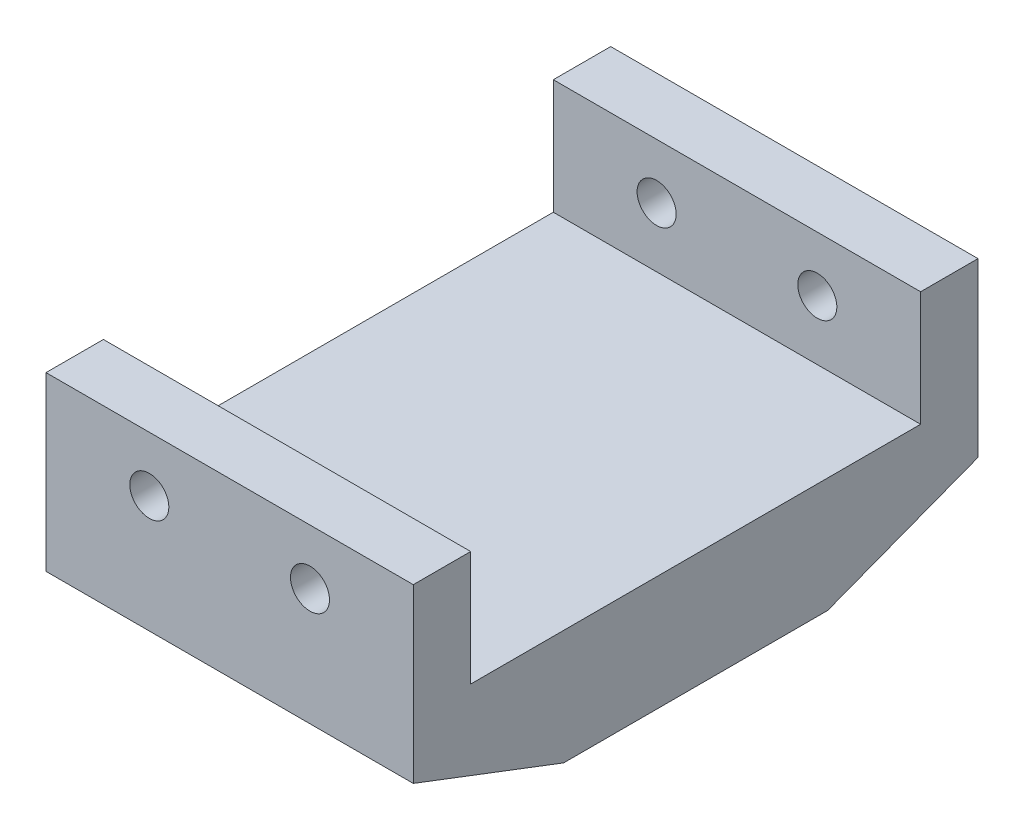
ISO-10303-21;
HEADER;
FILE_DESCRIPTION(('STEP AP214'),'2;1');
FILE_NAME('part.step','',(''),(''),'','','');
FILE_SCHEMA(('AUTOMOTIVE_DESIGN { 1 0 10303 214 1 1 1 1 }'));
ENDSEC;
DATA;
#1=APPLICATION_CONTEXT('core data for automotive mechanical design processes');
#2=APPLICATION_PROTOCOL_DEFINITION('international standard','automotive_design',2000,#1);
#3=PRODUCT_CONTEXT('',#1,'mechanical');
#4=PRODUCT('Part','Part','',(#3));
#5=PRODUCT_RELATED_PRODUCT_CATEGORY('part','',(#4));
#6=PRODUCT_DEFINITION_FORMATION('','',#4);
#7=PRODUCT_DEFINITION_CONTEXT('part definition',#1,'design');
#8=PRODUCT_DEFINITION('design','',#6,#7);
#9=PRODUCT_DEFINITION_SHAPE('','',#8);
#10=(LENGTH_UNIT() NAMED_UNIT(*) SI_UNIT(.MILLI.,.METRE.));
#11=(NAMED_UNIT(*) PLANE_ANGLE_UNIT() SI_UNIT($,.RADIAN.));
#12=(NAMED_UNIT(*) SI_UNIT($,.STERADIAN.) SOLID_ANGLE_UNIT());
#13=UNCERTAINTY_MEASURE_WITH_UNIT(LENGTH_MEASURE(1.E-05),#10,'distance_accuracy_value','');
#14=(GEOMETRIC_REPRESENTATION_CONTEXT(3) GLOBAL_UNCERTAINTY_ASSIGNED_CONTEXT((#13)) GLOBAL_UNIT_ASSIGNED_CONTEXT((#10,
#11,#12)) REPRESENTATION_CONTEXT('',''));
#15=CARTESIAN_POINT('',(0.,0.,0.));
#16=DIRECTION('',(0.,0.,1.));
#17=DIRECTION('',(1.,0.,0.));
#18=AXIS2_PLACEMENT_3D('',#15,#16,#17);
#19=CARTESIAN_POINT('',(7.,52.3000000000002,-24.5999999999998));
#20=DIRECTION('',(0.,0.,1.));
#21=DIRECTION('',(-1.,0.,0.));
#22=AXIS2_PLACEMENT_3D('',#19,#20,#21);
#23=CYLINDRICAL_SURFACE('',#22,1.7);
#24=CARTESIAN_POINT('',(7.,52.3000000000001,-19.5999999999998));
#25=DIRECTION('',(0.,0.,1.));
#26=DIRECTION('',(-1.,0.,0.));
#27=AXIS2_PLACEMENT_3D('',#24,#25,#26);
#28=CIRCLE('',#27,1.7);
#29=CARTESIAN_POINT('',(5.3,52.3000000000001,-19.5999999999998));
#30=VERTEX_POINT('',#29);
#31=EDGE_CURVE('E203',#30,#30,#28,.T.);
#32=CARTESIAN_POINT('',(7.,52.3000000000002,-24.5999999999998));
#33=DIRECTION('',(0.,0.,1.));
#34=DIRECTION('',(1.,0.,0.));
#35=AXIS2_PLACEMENT_3D('',#32,#33,#34);
#36=CIRCLE('',#35,1.7);
#37=CARTESIAN_POINT('',(5.3,52.3000000000002,-24.5999999999998));
#38=VERTEX_POINT('',#37);
#39=EDGE_CURVE('E210',#38,#38,#36,.T.);
#40=CARTESIAN_POINT('',(5.3,52.3000000000001,-19.5999999999998));
#41=CARTESIAN_POINT('',(5.3,52.3000000000001,-19.6520833333331));
#42=CARTESIAN_POINT('',(5.3,52.3000000000001,-19.7041666666664));
#43=CARTESIAN_POINT('',(5.3,52.3000000000001,-19.8083333333331));
#44=CARTESIAN_POINT('',(5.3,52.3000000000001,-19.8604166666664));
#45=CARTESIAN_POINT('',(5.3,52.3000000000001,-19.9645833333331));
#46=CARTESIAN_POINT('',(5.3,52.3000000000001,-20.0166666666664));
#47=CARTESIAN_POINT('',(5.3,52.3000000000001,-20.1208333333331));
#48=CARTESIAN_POINT('',(5.3,52.3000000000001,-20.1729166666664));
#49=CARTESIAN_POINT('',(5.3,52.3000000000001,-20.2770833333331));
#50=CARTESIAN_POINT('',(5.3,52.3000000000001,-20.3291666666664));
#51=CARTESIAN_POINT('',(5.3,52.3000000000001,-20.4333333333331));
#52=CARTESIAN_POINT('',(5.3,52.3000000000001,-20.4854166666664));
#53=CARTESIAN_POINT('',(5.3,52.3000000000001,-20.5895833333331));
#54=CARTESIAN_POINT('',(5.3,52.3000000000001,-20.6416666666664));
#55=CARTESIAN_POINT('',(5.3,52.3000000000001,-20.7458333333331));
#56=CARTESIAN_POINT('',(5.3,52.3000000000001,-20.7979166666664));
#57=CARTESIAN_POINT('',(5.3,52.3000000000001,-20.9020833333331));
#58=CARTESIAN_POINT('',(5.3,52.3000000000001,-20.9541666666664));
#59=CARTESIAN_POINT('',(5.3,52.3000000000001,-21.0583333333331));
#60=CARTESIAN_POINT('',(5.3,52.3000000000001,-21.1104166666664));
#61=CARTESIAN_POINT('',(5.3,52.3000000000001,-21.2145833333331));
#62=CARTESIAN_POINT('',(5.3,52.3000000000001,-21.2666666666664));
#63=CARTESIAN_POINT('',(5.3,52.3000000000001,-21.3708333333331));
#64=CARTESIAN_POINT('',(5.3,52.3000000000001,-21.4229166666664));
#65=CARTESIAN_POINT('',(5.3,52.3000000000001,-21.5270833333331));
#66=CARTESIAN_POINT('',(5.3,52.3000000000001,-21.5791666666664));
#67=CARTESIAN_POINT('',(5.3,52.3000000000001,-21.6833333333331));
#68=CARTESIAN_POINT('',(5.3,52.3000000000001,-21.7354166666664));
#69=CARTESIAN_POINT('',(5.3,52.3000000000001,-21.8395833333331));
#70=CARTESIAN_POINT('',(5.3,52.3000000000001,-21.8916666666664));
#71=CARTESIAN_POINT('',(5.3,52.3000000000001,-21.9958333333331));
#72=CARTESIAN_POINT('',(5.3,52.3000000000001,-22.0479166666664));
#73=CARTESIAN_POINT('',(5.3,52.3000000000001,-22.1520833333331));
#74=CARTESIAN_POINT('',(5.3,52.3000000000002,-22.2041666666664));
#75=CARTESIAN_POINT('',(5.3,52.3000000000002,-22.3083333333331));
#76=CARTESIAN_POINT('',(5.3,52.3000000000002,-22.3604166666664));
#77=CARTESIAN_POINT('',(5.3,52.3000000000002,-22.4645833333331));
#78=CARTESIAN_POINT('',(5.3,52.3000000000002,-22.5166666666664));
#79=CARTESIAN_POINT('',(5.3,52.3000000000002,-22.6208333333331));
#80=CARTESIAN_POINT('',(5.3,52.3000000000002,-22.6729166666664));
#81=CARTESIAN_POINT('',(5.3,52.3000000000002,-22.7770833333331));
#82=CARTESIAN_POINT('',(5.3,52.3000000000002,-22.8291666666664));
#83=CARTESIAN_POINT('',(5.3,52.3000000000002,-22.9333333333331));
#84=CARTESIAN_POINT('',(5.3,52.3000000000002,-22.9854166666664));
#85=CARTESIAN_POINT('',(5.3,52.3000000000002,-23.0895833333331));
#86=CARTESIAN_POINT('',(5.3,52.3000000000002,-23.1416666666664));
#87=CARTESIAN_POINT('',(5.3,52.3000000000002,-23.2458333333331));
#88=CARTESIAN_POINT('',(5.3,52.3000000000002,-23.2979166666664));
#89=CARTESIAN_POINT('',(5.3,52.3000000000002,-23.4020833333331));
#90=CARTESIAN_POINT('',(5.3,52.3000000000002,-23.4541666666664));
#91=CARTESIAN_POINT('',(5.3,52.3000000000002,-23.5583333333331));
#92=CARTESIAN_POINT('',(5.3,52.3000000000002,-23.6104166666664));
#93=CARTESIAN_POINT('',(5.3,52.3000000000002,-23.7145833333331));
#94=CARTESIAN_POINT('',(5.3,52.3000000000002,-23.7666666666664));
#95=CARTESIAN_POINT('',(5.3,52.3000000000002,-23.8708333333331));
#96=CARTESIAN_POINT('',(5.3,52.3000000000002,-23.9229166666664));
#97=CARTESIAN_POINT('',(5.3,52.3000000000002,-24.0270833333331));
#98=CARTESIAN_POINT('',(5.3,52.3000000000002,-24.0791666666664));
#99=CARTESIAN_POINT('',(5.3,52.3000000000002,-24.1833333333331));
#100=CARTESIAN_POINT('',(5.3,52.3000000000002,-24.2354166666664));
#101=CARTESIAN_POINT('',(5.3,52.3000000000002,-24.3395833333331));
#102=CARTESIAN_POINT('',(5.3,52.3000000000002,-24.3916666666664));
#103=CARTESIAN_POINT('',(5.3,52.3000000000002,-24.4958333333331));
#104=CARTESIAN_POINT('',(5.3,52.3000000000002,-24.5479166666664));
#105=CARTESIAN_POINT('',(5.3,52.3000000000002,-24.5999999999998));
#106=B_SPLINE_CURVE_WITH_KNOTS('',3,(#40,#41,#42,#43,#44,#45,#46,#47,#48,#49,#50,#51,#52,#53,
#54,#55,#56,#57,#58,#59,#60,#61,#62,#63,#64,#65,#66,#67,#68,#69,#70,#71,#72,#73,#74,#75,#76,#77,
#78,#79,#80,#81,#82,#83,#84,#85,#86,#87,#88,#89,#90,#91,#92,#93,#94,#95,#96,#97,#98,#99,#100,
#101,#102,#103,#104,#105),.UNSPECIFIED.,.F.,.F.,(4,2,2,2,2,2,2,2,2,2,2,2,2,2,2,2,2,2,2,2,2,2,2,
2,2,2,2,2,2,2,2,2,4),(0.,0.15625,0.3125,0.46875,0.625000000000001,0.781250000000001,
0.937500000000001,1.09375,1.25,1.40625,1.5625,1.71875,1.875,2.03125,2.1875,2.34375,2.5,2.65625,
2.8125,2.96875,3.125,3.28125,3.4375,3.59375,3.75,3.90625,4.0625,4.21875,4.375,4.53125,4.6875,
4.84375,5.),.UNSPECIFIED.);
#107=EDGE_CURVE('BSEAM43',#30,#38,#106,.T.);
#108=ORIENTED_EDGE('',*,*,#31,.T.);
#109=ORIENTED_EDGE('',*,*,#39,.F.);
#110=ORIENTED_EDGE('',*,*,#107,.T.);
#111=ORIENTED_EDGE('',*,*,#107,.F.);
#112=EDGE_LOOP('',(#108,#110,#109,#111));
#113=FACE_BOUND('',#112,.T.);
#114=ADVANCED_FACE('F43',(#113),#23,.F.);
#115=CARTESIAN_POINT('',(-7.,52.3000000000002,-24.5999999999998));
#116=DIRECTION('',(0.,0.,1.));
#117=DIRECTION('',(-1.,0.,0.));
#118=AXIS2_PLACEMENT_3D('',#115,#116,#117);
#119=CYLINDRICAL_SURFACE('',#118,1.7);
#120=CARTESIAN_POINT('',(-7.,52.3000000000001,-19.5999999999998));
#121=DIRECTION('',(0.,0.,1.));
#122=DIRECTION('',(-1.,0.,0.));
#123=AXIS2_PLACEMENT_3D('',#120,#121,#122);
#124=CIRCLE('',#123,1.7);
#125=CARTESIAN_POINT('',(-8.7,52.3000000000001,-19.5999999999998));
#126=VERTEX_POINT('',#125);
#127=EDGE_CURVE('E141',#126,#126,#124,.T.);
#128=CARTESIAN_POINT('',(-7.,52.3000000000002,-24.5999999999998));
#129=DIRECTION('',(0.,0.,1.));
#130=DIRECTION('',(-1.,0.,0.));
#131=AXIS2_PLACEMENT_3D('',#128,#129,#130);
#132=CIRCLE('',#131,1.7);
#133=CARTESIAN_POINT('',(-8.7,52.3000000000002,-24.5999999999998));
#134=VERTEX_POINT('',#133);
#135=EDGE_CURVE('E209',#134,#134,#132,.T.);
#136=CARTESIAN_POINT('',(-8.7,52.3000000000001,-19.5999999999998));
#137=CARTESIAN_POINT('',(-8.7,52.3000000000001,-19.6520833333331));
#138=CARTESIAN_POINT('',(-8.7,52.3000000000001,-19.7041666666664));
#139=CARTESIAN_POINT('',(-8.7,52.3000000000001,-19.8083333333331));
#140=CARTESIAN_POINT('',(-8.7,52.3000000000001,-19.8604166666664));
#141=CARTESIAN_POINT('',(-8.7,52.3000000000001,-19.9645833333331));
#142=CARTESIAN_POINT('',(-8.7,52.3000000000001,-20.0166666666664));
#143=CARTESIAN_POINT('',(-8.7,52.3000000000001,-20.1208333333331));
#144=CARTESIAN_POINT('',(-8.7,52.3000000000001,-20.1729166666664));
#145=CARTESIAN_POINT('',(-8.7,52.3000000000001,-20.2770833333331));
#146=CARTESIAN_POINT('',(-8.7,52.3000000000001,-20.3291666666664));
#147=CARTESIAN_POINT('',(-8.7,52.3000000000001,-20.4333333333331));
#148=CARTESIAN_POINT('',(-8.7,52.3000000000001,-20.4854166666664));
#149=CARTESIAN_POINT('',(-8.7,52.3000000000001,-20.5895833333331));
#150=CARTESIAN_POINT('',(-8.7,52.3000000000001,-20.6416666666664));
#151=CARTESIAN_POINT('',(-8.7,52.3000000000001,-20.7458333333331));
#152=CARTESIAN_POINT('',(-8.7,52.3000000000001,-20.7979166666664));
#153=CARTESIAN_POINT('',(-8.7,52.3000000000001,-20.9020833333331));
#154=CARTESIAN_POINT('',(-8.7,52.3000000000001,-20.9541666666664));
#155=CARTESIAN_POINT('',(-8.7,52.3000000000001,-21.0583333333331));
#156=CARTESIAN_POINT('',(-8.7,52.3000000000001,-21.1104166666664));
#157=CARTESIAN_POINT('',(-8.7,52.3000000000001,-21.2145833333331));
#158=CARTESIAN_POINT('',(-8.7,52.3000000000001,-21.2666666666664));
#159=CARTESIAN_POINT('',(-8.7,52.3000000000001,-21.3708333333331));
#160=CARTESIAN_POINT('',(-8.7,52.3000000000001,-21.4229166666664));
#161=CARTESIAN_POINT('',(-8.7,52.3000000000001,-21.5270833333331));
#162=CARTESIAN_POINT('',(-8.7,52.3000000000001,-21.5791666666664));
#163=CARTESIAN_POINT('',(-8.7,52.3000000000001,-21.6833333333331));
#164=CARTESIAN_POINT('',(-8.7,52.3000000000001,-21.7354166666664));
#165=CARTESIAN_POINT('',(-8.7,52.3000000000001,-21.8395833333331));
#166=CARTESIAN_POINT('',(-8.7,52.3000000000001,-21.8916666666664));
#167=CARTESIAN_POINT('',(-8.7,52.3000000000001,-21.9958333333331));
#168=CARTESIAN_POINT('',(-8.7,52.3000000000001,-22.0479166666664));
#169=CARTESIAN_POINT('',(-8.7,52.3000000000001,-22.1520833333331));
#170=CARTESIAN_POINT('',(-8.7,52.3000000000002,-22.2041666666664));
#171=CARTESIAN_POINT('',(-8.7,52.3000000000002,-22.3083333333331));
#172=CARTESIAN_POINT('',(-8.7,52.3000000000002,-22.3604166666664));
#173=CARTESIAN_POINT('',(-8.7,52.3000000000002,-22.4645833333331));
#174=CARTESIAN_POINT('',(-8.7,52.3000000000002,-22.5166666666664));
#175=CARTESIAN_POINT('',(-8.7,52.3000000000002,-22.6208333333331));
#176=CARTESIAN_POINT('',(-8.7,52.3000000000002,-22.6729166666664));
#177=CARTESIAN_POINT('',(-8.7,52.3000000000002,-22.7770833333331));
#178=CARTESIAN_POINT('',(-8.7,52.3000000000002,-22.8291666666664));
#179=CARTESIAN_POINT('',(-8.7,52.3000000000002,-22.9333333333331));
#180=CARTESIAN_POINT('',(-8.7,52.3000000000002,-22.9854166666664));
#181=CARTESIAN_POINT('',(-8.7,52.3000000000002,-23.0895833333331));
#182=CARTESIAN_POINT('',(-8.7,52.3000000000002,-23.1416666666664));
#183=CARTESIAN_POINT('',(-8.7,52.3000000000002,-23.2458333333331));
#184=CARTESIAN_POINT('',(-8.7,52.3000000000002,-23.2979166666664));
#185=CARTESIAN_POINT('',(-8.7,52.3000000000002,-23.4020833333331));
#186=CARTESIAN_POINT('',(-8.7,52.3000000000002,-23.4541666666664));
#187=CARTESIAN_POINT('',(-8.7,52.3000000000002,-23.5583333333331));
#188=CARTESIAN_POINT('',(-8.7,52.3000000000002,-23.6104166666664));
#189=CARTESIAN_POINT('',(-8.7,52.3000000000002,-23.7145833333331));
#190=CARTESIAN_POINT('',(-8.7,52.3000000000002,-23.7666666666664));
#191=CARTESIAN_POINT('',(-8.7,52.3000000000002,-23.8708333333331));
#192=CARTESIAN_POINT('',(-8.7,52.3000000000002,-23.9229166666664));
#193=CARTESIAN_POINT('',(-8.7,52.3000000000002,-24.0270833333331));
#194=CARTESIAN_POINT('',(-8.7,52.3000000000002,-24.0791666666664));
#195=CARTESIAN_POINT('',(-8.7,52.3000000000002,-24.1833333333331));
#196=CARTESIAN_POINT('',(-8.7,52.3000000000002,-24.2354166666664));
#197=CARTESIAN_POINT('',(-8.7,52.3000000000002,-24.3395833333331));
#198=CARTESIAN_POINT('',(-8.7,52.3000000000002,-24.3916666666664));
#199=CARTESIAN_POINT('',(-8.7,52.3000000000002,-24.4958333333331));
#200=CARTESIAN_POINT('',(-8.7,52.3000000000002,-24.5479166666664));
#201=CARTESIAN_POINT('',(-8.7,52.3000000000002,-24.5999999999998));
#202=B_SPLINE_CURVE_WITH_KNOTS('',3,(#136,#137,#138,#139,#140,#141,#142,#143,#144,#145,#146,
#147,#148,#149,#150,#151,#152,#153,#154,#155,#156,#157,#158,#159,#160,#161,#162,#163,#164,#165,
#166,#167,#168,#169,#170,#171,#172,#173,#174,#175,#176,#177,#178,#179,#180,#181,#182,#183,#184,
#185,#186,#187,#188,#189,#190,#191,#192,#193,#194,#195,#196,#197,#198,#199,#200,#201),
.UNSPECIFIED.,.F.,.F.,(4,2,2,2,2,2,2,2,2,2,2,2,2,2,2,2,2,2,2,2,2,2,2,2,2,2,2,2,2,2,2,2,4),(0.,
0.15625,0.3125,0.46875,0.625000000000001,0.781250000000001,0.937500000000001,1.09375,1.25,
1.40625,1.5625,1.71875,1.875,2.03125,2.1875,2.34375,2.5,2.65625,2.8125,2.96875,3.125,3.28125,
3.4375,3.59375,3.75,3.90625,4.0625,4.21875,4.375,4.53125,4.6875,4.84375,5.),.UNSPECIFIED.);
#203=EDGE_CURVE('BSEAM225',#126,#134,#202,.T.);
#204=ORIENTED_EDGE('',*,*,#127,.T.);
#205=ORIENTED_EDGE('',*,*,#135,.F.);
#206=ORIENTED_EDGE('',*,*,#203,.T.);
#207=ORIENTED_EDGE('',*,*,#203,.F.);
#208=EDGE_LOOP('',(#204,#206,#205,#207));
#209=FACE_BOUND('',#208,.T.);
#210=ADVANCED_FACE('F225',(#209),#119,.F.);
#211=CARTESIAN_POINT('',(7.,52.2999999999999,19.6000000000002));
#212=DIRECTION('',(0.,0.,-1.));
#213=DIRECTION('',(1.,0.,0.));
#214=AXIS2_PLACEMENT_3D('',#211,#212,#213);
#215=CIRCLE('',#214,1.7);
#216=CARTESIAN_POINT('',(5.3,52.2999999999999,19.6000000000003));
#217=VERTEX_POINT('',#216);
#218=EDGE_CURVE('E206',#217,#217,#215,.T.);
#219=CARTESIAN_POINT('',(7.,52.2999999999998,24.6000000000002));
#220=DIRECTION('',(0.,0.,1.));
#221=DIRECTION('',(1.,0.,0.));
#222=AXIS2_PLACEMENT_3D('',#219,#220,#221);
#223=CIRCLE('',#222,1.7);
#224=CARTESIAN_POINT('',(5.3,52.2999999999998,24.6000000000002));
#225=VERTEX_POINT('',#224);
#226=EDGE_CURVE('E213',#225,#225,#223,.T.);
#227=CARTESIAN_POINT('',(5.3,52.2999999999999,19.6000000000003));
#228=CARTESIAN_POINT('',(5.3,52.2999999999999,19.6520833333336));
#229=CARTESIAN_POINT('',(5.3,52.2999999999999,19.7041666666669));
#230=CARTESIAN_POINT('',(5.3,52.2999999999999,19.8083333333336));
#231=CARTESIAN_POINT('',(5.3,52.2999999999999,19.8604166666669));
#232=CARTESIAN_POINT('',(5.3,52.2999999999999,19.9645833333336));
#233=CARTESIAN_POINT('',(5.3,52.2999999999999,20.0166666666669));
#234=CARTESIAN_POINT('',(5.3,52.2999999999999,20.1208333333336));
#235=CARTESIAN_POINT('',(5.3,52.2999999999999,20.1729166666669));
#236=CARTESIAN_POINT('',(5.3,52.2999999999999,20.2770833333336));
#237=CARTESIAN_POINT('',(5.3,52.2999999999999,20.3291666666669));
#238=CARTESIAN_POINT('',(5.3,52.2999999999999,20.4333333333336));
#239=CARTESIAN_POINT('',(5.3,52.2999999999999,20.4854166666669));
#240=CARTESIAN_POINT('',(5.3,52.2999999999999,20.5895833333336));
#241=CARTESIAN_POINT('',(5.3,52.2999999999998,20.6416666666669));
#242=CARTESIAN_POINT('',(5.3,52.2999999999998,20.7458333333336));
#243=CARTESIAN_POINT('',(5.3,52.2999999999998,20.7979166666669));
#244=CARTESIAN_POINT('',(5.3,52.2999999999998,20.9020833333336));
#245=CARTESIAN_POINT('',(5.3,52.2999999999998,20.9541666666669));
#246=CARTESIAN_POINT('',(5.3,52.2999999999998,21.0583333333336));
#247=CARTESIAN_POINT('',(5.3,52.2999999999998,21.1104166666669));
#248=CARTESIAN_POINT('',(5.3,52.2999999999998,21.2145833333336));
#249=CARTESIAN_POINT('',(5.3,52.2999999999998,21.2666666666669));
#250=CARTESIAN_POINT('',(5.3,52.2999999999998,21.3708333333336));
#251=CARTESIAN_POINT('',(5.3,52.2999999999998,21.4229166666669));
#252=CARTESIAN_POINT('',(5.3,52.2999999999998,21.5270833333336));
#253=CARTESIAN_POINT('',(5.3,52.2999999999998,21.5791666666669));
#254=CARTESIAN_POINT('',(5.3,52.2999999999998,21.6833333333336));
#255=CARTESIAN_POINT('',(5.3,52.2999999999998,21.7354166666669));
#256=CARTESIAN_POINT('',(5.3,52.2999999999998,21.8395833333336));
#257=CARTESIAN_POINT('',(5.3,52.2999999999998,21.8916666666669));
#258=CARTESIAN_POINT('',(5.3,52.2999999999998,21.9958333333336));
#259=CARTESIAN_POINT('',(5.3,52.2999999999998,22.0479166666669));
#260=CARTESIAN_POINT('',(5.3,52.2999999999998,22.1520833333336));
#261=CARTESIAN_POINT('',(5.3,52.2999999999998,22.2041666666669));
#262=CARTESIAN_POINT('',(5.3,52.2999999999998,22.3083333333336));
#263=CARTESIAN_POINT('',(5.3,52.2999999999998,22.3604166666669));
#264=CARTESIAN_POINT('',(5.3,52.2999999999998,22.4645833333336));
#265=CARTESIAN_POINT('',(5.3,52.2999999999998,22.5166666666669));
#266=CARTESIAN_POINT('',(5.3,52.2999999999998,22.6208333333336));
#267=CARTESIAN_POINT('',(5.3,52.2999999999998,22.6729166666669));
#268=CARTESIAN_POINT('',(5.3,52.2999999999998,22.7770833333336));
#269=CARTESIAN_POINT('',(5.3,52.2999999999998,22.8291666666669));
#270=CARTESIAN_POINT('',(5.3,52.2999999999998,22.9333333333336));
#271=CARTESIAN_POINT('',(5.3,52.2999999999998,22.9854166666669));
#272=CARTESIAN_POINT('',(5.3,52.2999999999998,23.0895833333336));
#273=CARTESIAN_POINT('',(5.3,52.2999999999998,23.1416666666669));
#274=CARTESIAN_POINT('',(5.3,52.2999999999998,23.2458333333336));
#275=CARTESIAN_POINT('',(5.3,52.2999999999998,23.2979166666669));
#276=CARTESIAN_POINT('',(5.3,52.2999999999998,23.4020833333336));
#277=CARTESIAN_POINT('',(5.3,52.2999999999998,23.4541666666669));
#278=CARTESIAN_POINT('',(5.3,52.2999999999998,23.5583333333336));
#279=CARTESIAN_POINT('',(5.3,52.2999999999998,23.6104166666669));
#280=CARTESIAN_POINT('',(5.3,52.2999999999998,23.7145833333336));
#281=CARTESIAN_POINT('',(5.3,52.2999999999998,23.7666666666669));
#282=CARTESIAN_POINT('',(5.3,52.2999999999998,23.8708333333336));
#283=CARTESIAN_POINT('',(5.3,52.2999999999998,23.9229166666669));
#284=CARTESIAN_POINT('',(5.3,52.2999999999998,24.0270833333336));
#285=CARTESIAN_POINT('',(5.3,52.2999999999998,24.0791666666669));
#286=CARTESIAN_POINT('',(5.3,52.2999999999998,24.1833333333336));
#287=CARTESIAN_POINT('',(5.3,52.2999999999998,24.2354166666669));
#288=CARTESIAN_POINT('',(5.3,52.2999999999998,24.3395833333336));
#289=CARTESIAN_POINT('',(5.3,52.2999999999998,24.3916666666669));
#290=CARTESIAN_POINT('',(5.3,52.2999999999998,24.4958333333336));
#291=CARTESIAN_POINT('',(5.3,52.2999999999998,24.5479166666669));
#292=CARTESIAN_POINT('',(5.3,52.2999999999998,24.6000000000002));
#293=B_SPLINE_CURVE_WITH_KNOTS('',3,(#227,#228,#229,#230,#231,#232,#233,#234,#235,#236,#237,
#238,#239,#240,#241,#242,#243,#244,#245,#246,#247,#248,#249,#250,#251,#252,#253,#254,#255,#256,
#257,#258,#259,#260,#261,#262,#263,#264,#265,#266,#267,#268,#269,#270,#271,#272,#273,#274,#275,
#276,#277,#278,#279,#280,#281,#282,#283,#284,#285,#286,#287,#288,#289,#290,#291,#292),
.UNSPECIFIED.,.F.,.F.,(4,2,2,2,2,2,2,2,2,2,2,2,2,2,2,2,2,2,2,2,2,2,2,2,2,2,2,2,2,2,2,2,4),(0.,
0.156249999999997,0.3125,0.468749999999997,0.625000000000001,0.781249999999997,
0.937500000000001,1.09375,1.25,1.40625,1.56249999999999,1.71875,1.87499999999999,2.03125,2.1875,
2.34375,2.5,2.65624999999999,2.8125,2.96874999999999,3.125,3.28124999999999,3.4375,
3.59374999999999,3.74999999999999,3.90624999999999,4.06249999999999,4.21874999999999,
4.37499999999999,4.53124999999999,4.68749999999999,4.84374999999999,4.99999999999999),.UNSPECIFIED.);
#294=EDGE_CURVE('BSEAM227',#217,#225,#293,.T.);
#295=ORIENTED_EDGE('',*,*,#218,.T.);
#296=ORIENTED_EDGE('',*,*,#226,.T.);
#297=ORIENTED_EDGE('',*,*,#294,.T.);
#298=ORIENTED_EDGE('',*,*,#294,.F.);
#299=EDGE_LOOP('',(#295,#297,#296,#298));
#300=FACE_BOUND('',#299,.T.);
#301=ADVANCED_FACE('F227',(#300),#23,.F.);
#302=CARTESIAN_POINT('',(-7.,52.2999999999999,19.6000000000002));
#303=DIRECTION('',(0.,0.,-1.));
#304=DIRECTION('',(1.,0.,0.));
#305=AXIS2_PLACEMENT_3D('',#302,#303,#304);
#306=CIRCLE('',#305,1.7);
#307=CARTESIAN_POINT('',(-8.7,52.2999999999999,19.6000000000003));
#308=VERTEX_POINT('',#307);
#309=EDGE_CURVE('E144',#308,#308,#306,.T.);
#310=CARTESIAN_POINT('',(-7.,52.2999999999998,24.6000000000002));
#311=DIRECTION('',(0.,0.,1.));
#312=DIRECTION('',(-1.,0.,0.));
#313=AXIS2_PLACEMENT_3D('',#310,#311,#312);
#314=CIRCLE('',#313,1.7);
#315=CARTESIAN_POINT('',(-8.7,52.2999999999998,24.6000000000002));
#316=VERTEX_POINT('',#315);
#317=EDGE_CURVE('E216',#316,#316,#314,.T.);
#318=CARTESIAN_POINT('',(-8.7,52.2999999999999,19.6000000000003));
#319=CARTESIAN_POINT('',(-8.7,52.2999999999999,19.6520833333336));
#320=CARTESIAN_POINT('',(-8.7,52.2999999999999,19.7041666666669));
#321=CARTESIAN_POINT('',(-8.7,52.2999999999999,19.8083333333336));
#322=CARTESIAN_POINT('',(-8.7,52.2999999999999,19.8604166666669));
#323=CARTESIAN_POINT('',(-8.7,52.2999999999999,19.9645833333336));
#324=CARTESIAN_POINT('',(-8.7,52.2999999999999,20.0166666666669));
#325=CARTESIAN_POINT('',(-8.7,52.2999999999999,20.1208333333336));
#326=CARTESIAN_POINT('',(-8.7,52.2999999999999,20.1729166666669));
#327=CARTESIAN_POINT('',(-8.7,52.2999999999999,20.2770833333336));
#328=CARTESIAN_POINT('',(-8.7,52.2999999999999,20.3291666666669));
#329=CARTESIAN_POINT('',(-8.7,52.2999999999999,20.4333333333336));
#330=CARTESIAN_POINT('',(-8.7,52.2999999999999,20.4854166666669));
#331=CARTESIAN_POINT('',(-8.7,52.2999999999999,20.5895833333336));
#332=CARTESIAN_POINT('',(-8.7,52.2999999999998,20.6416666666669));
#333=CARTESIAN_POINT('',(-8.7,52.2999999999998,20.7458333333336));
#334=CARTESIAN_POINT('',(-8.7,52.2999999999998,20.7979166666669));
#335=CARTESIAN_POINT('',(-8.7,52.2999999999998,20.9020833333336));
#336=CARTESIAN_POINT('',(-8.7,52.2999999999998,20.9541666666669));
#337=CARTESIAN_POINT('',(-8.7,52.2999999999998,21.0583333333336));
#338=CARTESIAN_POINT('',(-8.7,52.2999999999998,21.1104166666669));
#339=CARTESIAN_POINT('',(-8.7,52.2999999999998,21.2145833333336));
#340=CARTESIAN_POINT('',(-8.7,52.2999999999998,21.2666666666669));
#341=CARTESIAN_POINT('',(-8.7,52.2999999999998,21.3708333333336));
#342=CARTESIAN_POINT('',(-8.7,52.2999999999998,21.4229166666669));
#343=CARTESIAN_POINT('',(-8.7,52.2999999999998,21.5270833333336));
#344=CARTESIAN_POINT('',(-8.7,52.2999999999998,21.5791666666669));
#345=CARTESIAN_POINT('',(-8.7,52.2999999999998,21.6833333333336));
#346=CARTESIAN_POINT('',(-8.7,52.2999999999998,21.7354166666669));
#347=CARTESIAN_POINT('',(-8.7,52.2999999999998,21.8395833333336));
#348=CARTESIAN_POINT('',(-8.7,52.2999999999998,21.8916666666669));
#349=CARTESIAN_POINT('',(-8.7,52.2999999999998,21.9958333333336));
#350=CARTESIAN_POINT('',(-8.7,52.2999999999998,22.0479166666669));
#351=CARTESIAN_POINT('',(-8.7,52.2999999999998,22.1520833333336));
#352=CARTESIAN_POINT('',(-8.7,52.2999999999998,22.2041666666669));
#353=CARTESIAN_POINT('',(-8.7,52.2999999999998,22.3083333333336));
#354=CARTESIAN_POINT('',(-8.7,52.2999999999998,22.3604166666669));
#355=CARTESIAN_POINT('',(-8.7,52.2999999999998,22.4645833333336));
#356=CARTESIAN_POINT('',(-8.7,52.2999999999998,22.5166666666669));
#357=CARTESIAN_POINT('',(-8.7,52.2999999999998,22.6208333333336));
#358=CARTESIAN_POINT('',(-8.7,52.2999999999998,22.6729166666669));
#359=CARTESIAN_POINT('',(-8.7,52.2999999999998,22.7770833333336));
#360=CARTESIAN_POINT('',(-8.7,52.2999999999998,22.8291666666669));
#361=CARTESIAN_POINT('',(-8.7,52.2999999999998,22.9333333333336));
#362=CARTESIAN_POINT('',(-8.7,52.2999999999998,22.9854166666669));
#363=CARTESIAN_POINT('',(-8.7,52.2999999999998,23.0895833333336));
#364=CARTESIAN_POINT('',(-8.7,52.2999999999998,23.1416666666669));
#365=CARTESIAN_POINT('',(-8.7,52.2999999999998,23.2458333333336));
#366=CARTESIAN_POINT('',(-8.7,52.2999999999998,23.2979166666669));
#367=CARTESIAN_POINT('',(-8.7,52.2999999999998,23.4020833333336));
#368=CARTESIAN_POINT('',(-8.7,52.2999999999998,23.4541666666669));
#369=CARTESIAN_POINT('',(-8.7,52.2999999999998,23.5583333333336));
#370=CARTESIAN_POINT('',(-8.7,52.2999999999998,23.6104166666669));
#371=CARTESIAN_POINT('',(-8.7,52.2999999999998,23.7145833333336));
#372=CARTESIAN_POINT('',(-8.7,52.2999999999998,23.7666666666669));
#373=CARTESIAN_POINT('',(-8.7,52.2999999999998,23.8708333333336));
#374=CARTESIAN_POINT('',(-8.7,52.2999999999998,23.9229166666669));
#375=CARTESIAN_POINT('',(-8.7,52.2999999999998,24.0270833333336));
#376=CARTESIAN_POINT('',(-8.7,52.2999999999998,24.0791666666669));
#377=CARTESIAN_POINT('',(-8.7,52.2999999999998,24.1833333333336));
#378=CARTESIAN_POINT('',(-8.7,52.2999999999998,24.2354166666669));
#379=CARTESIAN_POINT('',(-8.7,52.2999999999998,24.3395833333336));
#380=CARTESIAN_POINT('',(-8.7,52.2999999999998,24.3916666666669));
#381=CARTESIAN_POINT('',(-8.7,52.2999999999998,24.4958333333336));
#382=CARTESIAN_POINT('',(-8.7,52.2999999999998,24.5479166666669));
#383=CARTESIAN_POINT('',(-8.7,52.2999999999998,24.6000000000002));
#384=B_SPLINE_CURVE_WITH_KNOTS('',3,(#318,#319,#320,#321,#322,#323,#324,#325,#326,#327,#328,
#329,#330,#331,#332,#333,#334,#335,#336,#337,#338,#339,#340,#341,#342,#343,#344,#345,#346,#347,
#348,#349,#350,#351,#352,#353,#354,#355,#356,#357,#358,#359,#360,#361,#362,#363,#364,#365,#366,
#367,#368,#369,#370,#371,#372,#373,#374,#375,#376,#377,#378,#379,#380,#381,#382,#383),
.UNSPECIFIED.,.F.,.F.,(4,2,2,2,2,2,2,2,2,2,2,2,2,2,2,2,2,2,2,2,2,2,2,2,2,2,2,2,2,2,2,2,4),(0.,
0.156249999999997,0.3125,0.468749999999997,0.625000000000001,0.781249999999997,
0.937500000000001,1.09375,1.25,1.40625,1.56249999999999,1.71875,1.87499999999999,2.03125,2.1875,
2.34375,2.5,2.65624999999999,2.8125,2.96874999999999,3.125,3.28124999999999,3.4375,
3.59374999999999,3.74999999999999,3.90624999999999,4.06249999999999,4.21874999999999,
4.37499999999999,4.53124999999999,4.68749999999999,4.84374999999999,4.99999999999999),.UNSPECIFIED.);
#385=EDGE_CURVE('BSEAM230',#308,#316,#384,.T.);
#386=ORIENTED_EDGE('',*,*,#309,.T.);
#387=ORIENTED_EDGE('',*,*,#317,.T.);
#388=ORIENTED_EDGE('',*,*,#385,.T.);
#389=ORIENTED_EDGE('',*,*,#385,.F.);
#390=EDGE_LOOP('',(#386,#388,#387,#389));
#391=FACE_BOUND('',#390,.T.);
#392=ADVANCED_FACE('F230',(#391),#119,.F.);
#393=CARTESIAN_POINT('',(69.1096977961652,57.0999999999998,24.6000000000003));
#394=DIRECTION('',(0.,1.,0.));
#395=DIRECTION('',(0.,0.,1.));
#396=AXIS2_PLACEMENT_3D('',#393,#394,#395);
#397=PLANE('',#396);
#398=DIRECTION('',(0.,0.,1.));
#399=VECTOR('',#398,1.);
#400=CARTESIAN_POINT('',(16.,57.0999999999998,24.6000000000003));
#401=LINE('',#400,#399);
#402=CARTESIAN_POINT('',(16.,57.0999999999999,19.6000000000003));
#403=VERTEX_POINT('',#402);
#404=CARTESIAN_POINT('',(16.,57.0999999999998,24.6000000000003));
#405=VERTEX_POINT('',#404);
#406=EDGE_CURVE('E196',#403,#405,#401,.T.);
#407=ORIENTED_EDGE('',*,*,#406,.F.);
#408=DIRECTION('',(-1.,0.,0.));
#409=VECTOR('',#408,1.);
#410=CARTESIAN_POINT('',(69.1096977961652,57.0999999999999,19.6000000000003));
#411=LINE('',#410,#409);
#412=CARTESIAN_POINT('',(-16.,57.0999999999999,19.6000000000003));
#413=VERTEX_POINT('',#412);
#414=EDGE_CURVE('E180',#403,#413,#411,.T.);
#415=ORIENTED_EDGE('',*,*,#414,.T.);
#416=DIRECTION('',(0.,0.,-1.));
#417=VECTOR('',#416,1.);
#418=CARTESIAN_POINT('',(-16.,57.0999999999998,24.6000000000003));
#419=LINE('',#418,#417);
#420=CARTESIAN_POINT('',(-16.,57.0999999999998,24.6000000000003));
#421=VERTEX_POINT('',#420);
#422=EDGE_CURVE('E138',#421,#413,#419,.T.);
#423=ORIENTED_EDGE('',*,*,#422,.F.);
#424=DIRECTION('',(-1.,0.,0.));
#425=VECTOR('',#424,1.);
#426=CARTESIAN_POINT('',(69.1096977961652,57.0999999999998,24.6000000000003));
#427=LINE('',#426,#425);
#428=EDGE_CURVE('E129',#405,#421,#427,.T.);
#429=ORIENTED_EDGE('',*,*,#428,.F.);
#430=EDGE_LOOP('',(#407,#415,#423,#429));
#431=FACE_BOUND('',#430,.T.);
#432=ADVANCED_FACE('F239',(#431),#397,.T.);
#433=CARTESIAN_POINT('',(69.1096977961652,57.0999999999999,19.6000000000003));
#434=DIRECTION('',(0.,0.,-1.));
#435=DIRECTION('',(1.,0.,0.));
#436=AXIS2_PLACEMENT_3D('',#433,#434,#435);
#437=PLANE('',#436);
#438=ORIENTED_EDGE('',*,*,#309,.F.);
#439=EDGE_LOOP('',(#438));
#440=FACE_BOUND('',#439,.T.);
#441=ORIENTED_EDGE('',*,*,#218,.F.);
#442=EDGE_LOOP('',(#441));
#443=FACE_BOUND('',#442,.T.);
#444=DIRECTION('',(0.,1.,0.));
#445=VECTOR('',#444,1.);
#446=CARTESIAN_POINT('',(16.,57.0999999999999,19.6000000000003));
#447=LINE('',#446,#445);
#448=CARTESIAN_POINT('',(16.,47.0999999999999,19.6000000000002));
#449=VERTEX_POINT('',#448);
#450=EDGE_CURVE('E194',#449,#403,#447,.T.);
#451=ORIENTED_EDGE('',*,*,#450,.F.);
#452=DIRECTION('',(-1.,0.,0.));
#453=VECTOR('',#452,1.);
#454=CARTESIAN_POINT('',(69.1096977961652,47.0999999999999,19.6000000000002));
#455=LINE('',#454,#453);
#456=CARTESIAN_POINT('',(-16.,47.0999999999999,19.6000000000002));
#457=VERTEX_POINT('',#456);
#458=EDGE_CURVE('E178',#449,#457,#455,.T.);
#459=ORIENTED_EDGE('',*,*,#458,.T.);
#460=DIRECTION('',(0.,-1.,0.));
#461=VECTOR('',#460,1.);
#462=CARTESIAN_POINT('',(-16.,57.0999999999999,19.6000000000003));
#463=LINE('',#462,#461);
#464=EDGE_CURVE('E151',#413,#457,#463,.T.);
#465=ORIENTED_EDGE('',*,*,#464,.F.);
#466=ORIENTED_EDGE('',*,*,#414,.F.);
#467=EDGE_LOOP('',(#451,#459,#465,#466));
#468=FACE_BOUND('',#467,.T.);
#469=ADVANCED_FACE('F275',(#440,#443,#468),#437,.T.);
#470=CARTESIAN_POINT('',(69.1096977961652,47.0999999999999,19.6000000000002));
#471=DIRECTION('',(0.,1.,0.));
#472=DIRECTION('',(0.,0.,1.));
#473=AXIS2_PLACEMENT_3D('',#470,#471,#472);
#474=PLANE('',#473);
#475=DIRECTION('',(0.,0.,1.));
#476=VECTOR('',#475,1.);
#477=CARTESIAN_POINT('',(16.,47.0999999999999,19.6000000000002));
#478=LINE('',#477,#476);
#479=CARTESIAN_POINT('',(16.,47.1000000000001,-19.5999999999998));
#480=VERTEX_POINT('',#479);
#481=EDGE_CURVE('E192',#480,#449,#478,.T.);
#482=ORIENTED_EDGE('',*,*,#481,.F.);
#483=DIRECTION('',(-1.,0.,0.));
#484=VECTOR('',#483,1.);
#485=CARTESIAN_POINT('',(69.1096977961652,47.1000000000001,-19.5999999999998));
#486=LINE('',#485,#484);
#487=CARTESIAN_POINT('',(-16.,47.1000000000001,-19.5999999999998));
#488=VERTEX_POINT('',#487);
#489=EDGE_CURVE('E176',#480,#488,#486,.T.);
#490=ORIENTED_EDGE('',*,*,#489,.T.);
#491=DIRECTION('',(0.,0.,-1.));
#492=VECTOR('',#491,1.);
#493=CARTESIAN_POINT('',(-16.,47.0999999999999,19.6000000000002));
#494=LINE('',#493,#492);
#495=EDGE_CURVE('E154',#457,#488,#494,.T.);
#496=ORIENTED_EDGE('',*,*,#495,.F.);
#497=ORIENTED_EDGE('',*,*,#458,.F.);
#498=EDGE_LOOP('',(#482,#490,#496,#497));
#499=FACE_BOUND('',#498,.T.);
#500=ADVANCED_FACE('F271',(#499),#474,.T.);
#501=CARTESIAN_POINT('',(69.1096977961652,57.1000000000001,-19.5999999999997));
#502=DIRECTION('',(0.,0.,1.));
#503=DIRECTION('',(-1.,0.,0.));
#504=AXIS2_PLACEMENT_3D('',#501,#502,#503);
#505=PLANE('',#504);
#506=ORIENTED_EDGE('',*,*,#127,.F.);
#507=EDGE_LOOP('',(#506));
#508=FACE_BOUND('',#507,.T.);
#509=ORIENTED_EDGE('',*,*,#31,.F.);
#510=EDGE_LOOP('',(#509));
#511=FACE_BOUND('',#510,.T.);
#512=DIRECTION('',(0.,-1.,0.));
#513=VECTOR('',#512,1.);
#514=CARTESIAN_POINT('',(16.,57.1000000000001,-19.5999999999997));
#515=LINE('',#514,#513);
#516=CARTESIAN_POINT('',(16.,57.1000000000001,-19.5999999999997));
#517=VERTEX_POINT('',#516);
#518=EDGE_CURVE('E188',#517,#480,#515,.T.);
#519=ORIENTED_EDGE('',*,*,#518,.F.);
#520=DIRECTION('',(-1.,0.,0.));
#521=VECTOR('',#520,1.);
#522=CARTESIAN_POINT('',(69.1096977961652,57.1000000000001,-19.5999999999997));
#523=LINE('',#522,#521);
#524=CARTESIAN_POINT('',(-16.,57.1000000000001,-19.5999999999997));
#525=VERTEX_POINT('',#524);
#526=EDGE_CURVE('E174',#517,#525,#523,.T.);
#527=ORIENTED_EDGE('',*,*,#526,.T.);
#528=DIRECTION('',(0.,1.,0.));
#529=VECTOR('',#528,1.);
#530=CARTESIAN_POINT('',(-16.,57.1000000000001,-19.5999999999997));
#531=LINE('',#530,#529);
#532=EDGE_CURVE('E157',#488,#525,#531,.T.);
#533=ORIENTED_EDGE('',*,*,#532,.F.);
#534=ORIENTED_EDGE('',*,*,#489,.F.);
#535=EDGE_LOOP('',(#519,#527,#533,#534));
#536=FACE_BOUND('',#535,.T.);
#537=ADVANCED_FACE('F265',(#508,#511,#536),#505,.T.);
#538=CARTESIAN_POINT('',(69.1096977961652,57.1000000000002,-24.5999999999997));
#539=DIRECTION('',(0.,1.,0.));
#540=DIRECTION('',(0.,0.,1.));
#541=AXIS2_PLACEMENT_3D('',#538,#539,#540);
#542=PLANE('',#541);
#543=DIRECTION('',(0.,0.,1.));
#544=VECTOR('',#543,1.);
#545=CARTESIAN_POINT('',(16.,57.1000000000002,-24.5999999999997));
#546=LINE('',#545,#544);
#547=CARTESIAN_POINT('',(16.,57.1000000000002,-24.5999999999997));
#548=VERTEX_POINT('',#547);
#549=EDGE_CURVE('E186',#548,#517,#546,.T.);
#550=ORIENTED_EDGE('',*,*,#549,.F.);
#551=DIRECTION('',(-1.,0.,0.));
#552=VECTOR('',#551,1.);
#553=CARTESIAN_POINT('',(69.1096977961652,57.1000000000002,-24.5999999999997));
#554=LINE('',#553,#552);
#555=CARTESIAN_POINT('',(-16.,57.1000000000002,-24.5999999999997));
#556=VERTEX_POINT('',#555);
#557=EDGE_CURVE('E172',#548,#556,#554,.T.);
#558=ORIENTED_EDGE('',*,*,#557,.T.);
#559=DIRECTION('',(0.,0.,-1.));
#560=VECTOR('',#559,1.);
#561=CARTESIAN_POINT('',(-16.,57.1000000000002,-24.5999999999997));
#562=LINE('',#561,#560);
#563=EDGE_CURVE('E160',#525,#556,#562,.T.);
#564=ORIENTED_EDGE('',*,*,#563,.F.);
#565=ORIENTED_EDGE('',*,*,#526,.F.);
#566=EDGE_LOOP('',(#550,#558,#564,#565));
#567=FACE_BOUND('',#566,.T.);
#568=ADVANCED_FACE('F260',(#567),#542,.T.);
#569=CARTESIAN_POINT('',(69.1096977961652,42.1000000000002,-24.5999999999998));
#570=DIRECTION('',(0.,0.,-1.));
#571=DIRECTION('',(1.,0.,0.));
#572=AXIS2_PLACEMENT_3D('',#569,#570,#571);
#573=PLANE('',#572);
#574=ORIENTED_EDGE('',*,*,#135,.T.);
#575=EDGE_LOOP('',(#574));
#576=FACE_BOUND('',#575,.T.);
#577=ORIENTED_EDGE('',*,*,#39,.T.);
#578=EDGE_LOOP('',(#577));
#579=FACE_BOUND('',#578,.T.);
#580=DIRECTION('',(0.,1.,0.));
#581=VECTOR('',#580,1.);
#582=CARTESIAN_POINT('',(16.,42.1000000000002,-24.5999999999998));
#583=LINE('',#582,#581);
#584=CARTESIAN_POINT('',(16.,42.1000000000002,-24.5999999999998));
#585=VERTEX_POINT('',#584);
#586=EDGE_CURVE('E182',#585,#548,#583,.T.);
#587=ORIENTED_EDGE('',*,*,#586,.F.);
#588=DIRECTION('',(-1.,0.,0.));
#589=VECTOR('',#588,1.);
#590=CARTESIAN_POINT('',(69.1096977961652,42.1000000000002,-24.5999999999998));
#591=LINE('',#590,#589);
#592=CARTESIAN_POINT('',(-16.,42.1000000000002,-24.5999999999998));
#593=VERTEX_POINT('',#592);
#594=EDGE_CURVE('E170',#585,#593,#591,.T.);
#595=ORIENTED_EDGE('',*,*,#594,.T.);
#596=DIRECTION('',(0.,-1.,0.));
#597=VECTOR('',#596,1.);
#598=CARTESIAN_POINT('',(-16.,42.1000000000002,-24.5999999999998));
#599=LINE('',#598,#597);
#600=EDGE_CURVE('E163',#556,#593,#599,.T.);
#601=ORIENTED_EDGE('',*,*,#600,.F.);
#602=ORIENTED_EDGE('',*,*,#557,.F.);
#603=EDGE_LOOP('',(#587,#595,#601,#602));
#604=FACE_BOUND('',#603,.T.);
#605=ADVANCED_FACE('F222',(#576,#579,#604),#573,.T.);
#606=CARTESIAN_POINT('',(-16.,7.60000000000007,-11.5000000000001));
#607=DIRECTION('',(1.,0.,0.));
#608=DIRECTION('',(0.,0.,1.));
#609=AXIS2_PLACEMENT_3D('',#606,#607,#608);
#610=PLANE('',#609);
#611=DIRECTION('',(0.,-0.356588393011355,0.934261589689729));
#612=VECTOR('',#611,1.);
#613=CARTESIAN_POINT('',(-16.,42.1000000000002,-24.5999999999998));
#614=LINE('',#613,#612);
#615=CARTESIAN_POINT('',(-16.,37.1000000000001,-11.4999999999999));
#616=VERTEX_POINT('',#615);
#617=EDGE_CURVE('E130',#593,#616,#614,.T.);
#618=ORIENTED_EDGE('',*,*,#617,.T.);
#619=DIRECTION('',(0.,0.,1.));
#620=VECTOR('',#619,1.);
#621=CARTESIAN_POINT('',(-16.,37.0999999999999,11.5000000000001));
#622=LINE('',#621,#620);
#623=CARTESIAN_POINT('',(-16.,37.0999999999999,11.5000000000001));
#624=VERTEX_POINT('',#623);
#625=EDGE_CURVE('E59',#616,#624,#622,.T.);
#626=ORIENTED_EDGE('',*,*,#625,.T.);
#627=DIRECTION('',(0.,0.356588393011341,0.934261589689734));
#628=VECTOR('',#627,1.);
#629=CARTESIAN_POINT('',(-16.,42.0999999999998,24.6000000000002));
#630=LINE('',#629,#628);
#631=CARTESIAN_POINT('',(-16.,42.0999999999998,24.6000000000002));
#632=VERTEX_POINT('',#631);
#633=EDGE_CURVE('E124',#624,#632,#630,.T.);
#634=ORIENTED_EDGE('',*,*,#633,.T.);
#635=DIRECTION('',(0.,1.,0.));
#636=VECTOR('',#635,1.);
#637=CARTESIAN_POINT('',(-16.,42.0999999999998,24.6000000000002));
#638=LINE('',#637,#636);
#639=EDGE_CURVE('E133',#632,#421,#638,.T.);
#640=ORIENTED_EDGE('',*,*,#639,.T.);
#641=ORIENTED_EDGE('',*,*,#422,.T.);
#642=ORIENTED_EDGE('',*,*,#464,.T.);
#643=ORIENTED_EDGE('',*,*,#495,.T.);
#644=ORIENTED_EDGE('',*,*,#532,.T.);
#645=ORIENTED_EDGE('',*,*,#563,.T.);
#646=ORIENTED_EDGE('',*,*,#600,.T.);
#647=EDGE_LOOP('',(#618,#626,#634,#640,#641,#642,#643,#644,#645,#646));
#648=FACE_BOUND('',#647,.T.);
#649=ADVANCED_FACE('F140',(#648),#610,.F.);
#650=CARTESIAN_POINT('',(69.1096977961652,42.0999999999998,24.6000000000002));
#651=DIRECTION('',(0.,0.,1.));
#652=DIRECTION('',(-1.,0.,0.));
#653=AXIS2_PLACEMENT_3D('',#650,#651,#652);
#654=PLANE('',#653);
#655=ORIENTED_EDGE('',*,*,#317,.F.);
#656=EDGE_LOOP('',(#655));
#657=FACE_BOUND('',#656,.T.);
#658=ORIENTED_EDGE('',*,*,#226,.F.);
#659=EDGE_LOOP('',(#658));
#660=FACE_BOUND('',#659,.T.);
#661=DIRECTION('',(0.,-1.,0.));
#662=VECTOR('',#661,1.);
#663=CARTESIAN_POINT('',(16.,42.0999999999998,24.6000000000002));
#664=LINE('',#663,#662);
#665=CARTESIAN_POINT('',(16.,42.0999999999998,24.6000000000002));
#666=VERTEX_POINT('',#665);
#667=EDGE_CURVE('E198',#405,#666,#664,.T.);
#668=ORIENTED_EDGE('',*,*,#667,.F.);
#669=ORIENTED_EDGE('',*,*,#428,.T.);
#670=ORIENTED_EDGE('',*,*,#639,.F.);
#671=DIRECTION('',(-1.,0.,0.));
#672=VECTOR('',#671,1.);
#673=CARTESIAN_POINT('',(69.1096977961652,42.0999999999998,24.6000000000002));
#674=LINE('',#673,#672);
#675=EDGE_CURVE('E121',#666,#632,#674,.T.);
#676=ORIENTED_EDGE('',*,*,#675,.F.);
#677=EDGE_LOOP('',(#668,#669,#670,#676));
#678=FACE_BOUND('',#677,.T.);
#679=ADVANCED_FACE('F134',(#657,#660,#678),#654,.T.);
#680=CARTESIAN_POINT('',(16.,7.60000000000007,-11.5000000000001));
#681=DIRECTION('',(-1.,0.,0.));
#682=DIRECTION('',(0.,0.,-1.));
#683=AXIS2_PLACEMENT_3D('',#680,#681,#682);
#684=PLANE('',#683);
#685=DIRECTION('',(0.,-0.356588393011341,-0.934261589689734));
#686=VECTOR('',#685,1.);
#687=CARTESIAN_POINT('',(16.,42.0999999999998,24.6000000000002));
#688=LINE('',#687,#686);
#689=CARTESIAN_POINT('',(16.,37.0999999999999,11.5000000000001));
#690=VERTEX_POINT('',#689);
#691=EDGE_CURVE('E126',#666,#690,#688,.T.);
#692=ORIENTED_EDGE('',*,*,#691,.T.);
#693=DIRECTION('',(0.,0.,-1.));
#694=VECTOR('',#693,1.);
#695=CARTESIAN_POINT('',(16.,37.0999999999999,11.5000000000001));
#696=LINE('',#695,#694);
#697=CARTESIAN_POINT('',(16.,37.1000000000001,-11.4999999999999));
#698=VERTEX_POINT('',#697);
#699=EDGE_CURVE('E47',#690,#698,#696,.T.);
#700=ORIENTED_EDGE('',*,*,#699,.T.);
#701=DIRECTION('',(0.,0.356588393011355,-0.934261589689729));
#702=VECTOR('',#701,1.);
#703=CARTESIAN_POINT('',(16.,42.1000000000002,-24.5999999999998));
#704=LINE('',#703,#702);
#705=EDGE_CURVE('E147',#698,#585,#704,.T.);
#706=ORIENTED_EDGE('',*,*,#705,.T.);
#707=ORIENTED_EDGE('',*,*,#586,.T.);
#708=ORIENTED_EDGE('',*,*,#549,.T.);
#709=ORIENTED_EDGE('',*,*,#518,.T.);
#710=ORIENTED_EDGE('',*,*,#481,.T.);
#711=ORIENTED_EDGE('',*,*,#450,.T.);
#712=ORIENTED_EDGE('',*,*,#406,.T.);
#713=ORIENTED_EDGE('',*,*,#667,.T.);
#714=EDGE_LOOP('',(#692,#700,#706,#707,#708,#709,#710,#711,#712,#713));
#715=FACE_BOUND('',#714,.T.);
#716=ADVANCED_FACE('F45',(#715),#684,.F.);
#717=CARTESIAN_POINT('',(69.1096977961652,42.0999999999998,24.6000000000002));
#718=DIRECTION('',(0.,-0.934261589689734,0.356588393011341));
#719=DIRECTION('',(0.,-0.356588393011341,-0.934261589689734));
#720=AXIS2_PLACEMENT_3D('',#717,#718,#719);
#721=PLANE('',#720);
#722=ORIENTED_EDGE('',*,*,#691,.F.);
#723=ORIENTED_EDGE('',*,*,#675,.T.);
#724=ORIENTED_EDGE('',*,*,#633,.F.);
#725=DIRECTION('',(-1.,0.,0.));
#726=VECTOR('',#725,1.);
#727=CARTESIAN_POINT('',(69.1096977961652,37.0999999999999,11.5000000000001));
#728=LINE('',#727,#726);
#729=EDGE_CURVE('E11',#690,#624,#728,.T.);
#730=ORIENTED_EDGE('',*,*,#729,.F.);
#731=EDGE_LOOP('',(#722,#723,#724,#730));
#732=FACE_BOUND('',#731,.T.);
#733=ADVANCED_FACE('F123',(#732),#721,.T.);
#734=CARTESIAN_POINT('',(69.1096977961652,42.1000000000002,-24.5999999999998));
#735=DIRECTION('',(0.,-0.934261589689729,-0.356588393011355));
#736=DIRECTION('',(0.,0.356588393011355,-0.934261589689729));
#737=AXIS2_PLACEMENT_3D('',#734,#735,#736);
#738=PLANE('',#737);
#739=ORIENTED_EDGE('',*,*,#705,.F.);
#740=DIRECTION('',(-1.,0.,0.));
#741=VECTOR('',#740,1.);
#742=CARTESIAN_POINT('',(69.1096977961652,37.1000000000001,-11.4999999999999));
#743=LINE('',#742,#741);
#744=EDGE_CURVE('E167',#698,#616,#743,.T.);
#745=ORIENTED_EDGE('',*,*,#744,.T.);
#746=ORIENTED_EDGE('',*,*,#617,.F.);
#747=ORIENTED_EDGE('',*,*,#594,.F.);
#748=EDGE_LOOP('',(#739,#745,#746,#747));
#749=FACE_BOUND('',#748,.T.);
#750=ADVANCED_FACE('F243',(#749),#738,.T.);
#751=CARTESIAN_POINT('',(0.,37.1,1.35470961500641E-13));
#752=DIRECTION('',(0.,-1.,0.));
#753=DIRECTION('',(0.,0.,-1.));
#754=AXIS2_PLACEMENT_3D('',#751,#752,#753);
#755=PLANE('',#754);
#756=ORIENTED_EDGE('',*,*,#699,.F.);
#757=ORIENTED_EDGE('',*,*,#729,.T.);
#758=ORIENTED_EDGE('',*,*,#625,.F.);
#759=ORIENTED_EDGE('',*,*,#744,.F.);
#760=EDGE_LOOP('',(#756,#757,#758,#759));
#761=FACE_BOUND('',#760,.T.);
#762=ADVANCED_FACE('F241',(#761),#755,.T.);
#763=CLOSED_SHELL('',(#114,#210,#301,#392,#432,#469,#500,#537,#568,#605,#649,#679,#716,#733,
#750,#762));
#764=MANIFOLD_SOLID_BREP('B2',#763);
#765=ADVANCED_BREP_SHAPE_REPRESENTATION('',(#18,#764),#14);
#766=SHAPE_DEFINITION_REPRESENTATION(#9,#765);
ENDSEC;
END-ISO-10303-21;
